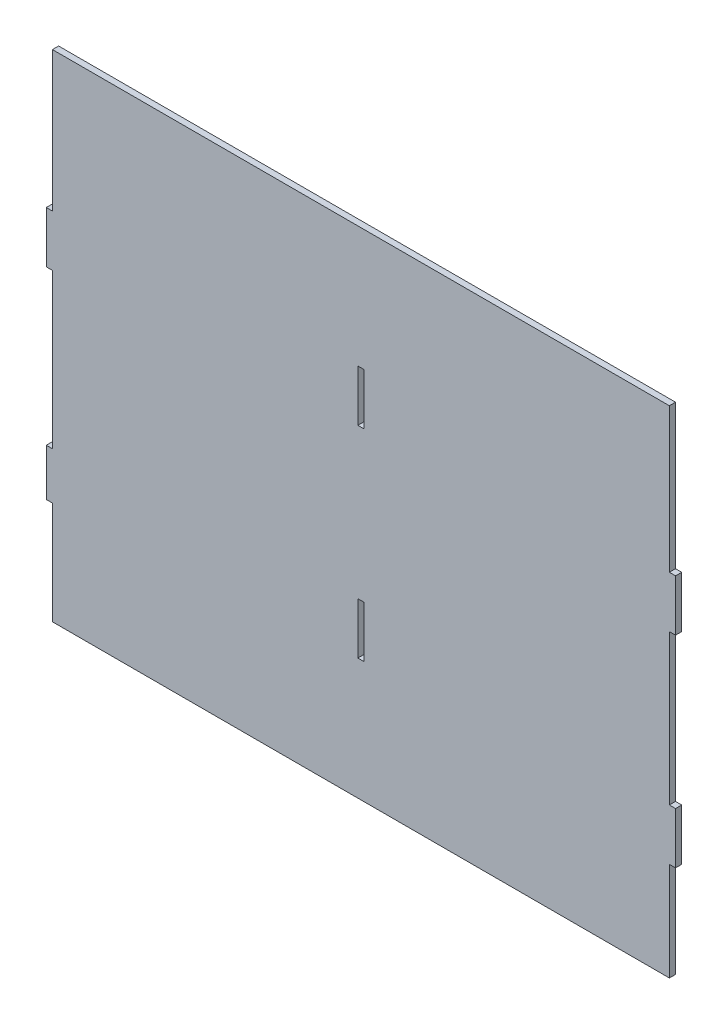
ISO-10303-21;
HEADER;
FILE_DESCRIPTION(('STEP AP214'),'2;1');
FILE_NAME('part.step','',(''),(''),'','','');
FILE_SCHEMA(('AUTOMOTIVE_DESIGN { 1 0 10303 214 1 1 1 1 }'));
ENDSEC;
DATA;
#1=APPLICATION_CONTEXT('core data for automotive mechanical design processes');
#2=APPLICATION_PROTOCOL_DEFINITION('international standard','automotive_design',2000,#1);
#3=PRODUCT_CONTEXT('',#1,'mechanical');
#4=PRODUCT('Part','Part','',(#3));
#5=PRODUCT_RELATED_PRODUCT_CATEGORY('part','',(#4));
#6=PRODUCT_DEFINITION_FORMATION('','',#4);
#7=PRODUCT_DEFINITION_CONTEXT('part definition',#1,'design');
#8=PRODUCT_DEFINITION('design','',#6,#7);
#9=PRODUCT_DEFINITION_SHAPE('','',#8);
#10=(LENGTH_UNIT() NAMED_UNIT(*) SI_UNIT(.MILLI.,.METRE.));
#11=(NAMED_UNIT(*) PLANE_ANGLE_UNIT() SI_UNIT($,.RADIAN.));
#12=(NAMED_UNIT(*) SI_UNIT($,.STERADIAN.) SOLID_ANGLE_UNIT());
#13=UNCERTAINTY_MEASURE_WITH_UNIT(LENGTH_MEASURE(1.E-05),#10,'distance_accuracy_value','');
#14=(GEOMETRIC_REPRESENTATION_CONTEXT(3) GLOBAL_UNCERTAINTY_ASSIGNED_CONTEXT((#13)) GLOBAL_UNIT_ASSIGNED_CONTEXT((#10,
#11,#12)) REPRESENTATION_CONTEXT('',''));
#15=CARTESIAN_POINT('',(0.,0.,0.));
#16=DIRECTION('',(0.,0.,1.));
#17=DIRECTION('',(1.,0.,0.));
#18=AXIS2_PLACEMENT_3D('',#15,#16,#17);
#19=CARTESIAN_POINT('',(0.,0.,6.));
#20=DIRECTION('',(0.,0.,1.));
#21=DIRECTION('',(1.,0.,0.));
#22=AXIS2_PLACEMENT_3D('',#19,#20,#21);
#23=PLANE('',#22);
#24=DIRECTION('',(0.,1.,0.));
#25=VECTOR('',#24,1.);
#26=CARTESIAN_POINT('',(300.,-145.267718015529,6.));
#27=LINE('',#26,#25);
#28=CARTESIAN_POINT('',(300.,-241.,6.));
#29=VERTEX_POINT('',#28);
#30=CARTESIAN_POINT('',(300.,-145.267718015529,6.));
#31=VERTEX_POINT('',#30);
#32=EDGE_CURVE('E285',#29,#31,#27,.T.);
#33=ORIENTED_EDGE('',*,*,#32,.T.);
#34=DIRECTION('',(1.,0.,0.));
#35=VECTOR('',#34,1.);
#36=CARTESIAN_POINT('',(306.,-145.267718015529,6.));
#37=LINE('',#36,#35);
#38=CARTESIAN_POINT('',(306.,-145.267718015529,6.));
#39=VERTEX_POINT('',#38);
#40=EDGE_CURVE('E288',#31,#39,#37,.T.);
#41=ORIENTED_EDGE('',*,*,#40,.T.);
#42=DIRECTION('',(0.,1.,0.));
#43=VECTOR('',#42,1.);
#44=CARTESIAN_POINT('',(306.,-145.267718015529,6.));
#45=LINE('',#44,#43);
#46=CARTESIAN_POINT('',(306.,-95.2677180155292,6.));
#47=VERTEX_POINT('',#46);
#48=EDGE_CURVE('E291',#39,#47,#45,.T.);
#49=ORIENTED_EDGE('',*,*,#48,.T.);
#50=DIRECTION('',(-1.,0.,0.));
#51=VECTOR('',#50,1.);
#52=CARTESIAN_POINT('',(306.,-95.2677180155292,6.));
#53=LINE('',#52,#51);
#54=CARTESIAN_POINT('',(300.,-95.2677180155292,6.));
#55=VERTEX_POINT('',#54);
#56=EDGE_CURVE('E293',#47,#55,#53,.T.);
#57=ORIENTED_EDGE('',*,*,#56,.T.);
#58=DIRECTION('',(0.,1.,0.));
#59=VECTOR('',#58,1.);
#60=CARTESIAN_POINT('',(300.,50.7322819844708,6.));
#61=LINE('',#60,#59);
#62=CARTESIAN_POINT('',(300.,50.7322819844708,6.));
#63=VERTEX_POINT('',#62);
#64=EDGE_CURVE('E295',#55,#63,#61,.T.);
#65=ORIENTED_EDGE('',*,*,#64,.T.);
#66=DIRECTION('',(1.,0.,0.));
#67=VECTOR('',#66,1.);
#68=CARTESIAN_POINT('',(306.,50.7322819844708,6.));
#69=LINE('',#68,#67);
#70=CARTESIAN_POINT('',(306.,50.7322819844708,6.));
#71=VERTEX_POINT('',#70);
#72=EDGE_CURVE('E297',#63,#71,#69,.T.);
#73=ORIENTED_EDGE('',*,*,#72,.T.);
#74=DIRECTION('',(0.,1.,0.));
#75=VECTOR('',#74,1.);
#76=CARTESIAN_POINT('',(306.,100.732281984471,6.));
#77=LINE('',#76,#75);
#78=CARTESIAN_POINT('',(306.,100.732281984471,6.));
#79=VERTEX_POINT('',#78);
#80=EDGE_CURVE('E299',#71,#79,#77,.T.);
#81=ORIENTED_EDGE('',*,*,#80,.T.);
#82=DIRECTION('',(-1.,0.,0.));
#83=VECTOR('',#82,1.);
#84=CARTESIAN_POINT('',(306.,100.732281984471,6.));
#85=LINE('',#84,#83);
#86=CARTESIAN_POINT('',(300.,100.732281984471,6.));
#87=VERTEX_POINT('',#86);
#88=EDGE_CURVE('E301',#79,#87,#85,.T.);
#89=ORIENTED_EDGE('',*,*,#88,.T.);
#90=DIRECTION('',(0.,1.,0.));
#91=VECTOR('',#90,1.);
#92=CARTESIAN_POINT('',(300.,241.,6.));
#93=LINE('',#92,#91);
#94=CARTESIAN_POINT('',(300.,241.,6.));
#95=VERTEX_POINT('',#94);
#96=EDGE_CURVE('E303',#87,#95,#93,.T.);
#97=ORIENTED_EDGE('',*,*,#96,.T.);
#98=DIRECTION('',(-1.,0.,0.));
#99=VECTOR('',#98,1.);
#100=CARTESIAN_POINT('',(-300.,241.,6.));
#101=LINE('',#100,#99);
#102=CARTESIAN_POINT('',(-300.,241.,6.));
#103=VERTEX_POINT('',#102);
#104=EDGE_CURVE('E305',#95,#103,#101,.T.);
#105=ORIENTED_EDGE('',*,*,#104,.T.);
#106=DIRECTION('',(0.,-1.,0.));
#107=VECTOR('',#106,1.);
#108=CARTESIAN_POINT('',(-300.,241.,6.));
#109=LINE('',#108,#107);
#110=CARTESIAN_POINT('',(-300.,105.,6.));
#111=VERTEX_POINT('',#110);
#112=EDGE_CURVE('E307',#103,#111,#109,.T.);
#113=ORIENTED_EDGE('',*,*,#112,.T.);
#114=DIRECTION('',(-1.,0.,0.));
#115=VECTOR('',#114,1.);
#116=CARTESIAN_POINT('',(-306.,105.,6.));
#117=LINE('',#116,#115);
#118=CARTESIAN_POINT('',(-306.,105.,6.));
#119=VERTEX_POINT('',#118);
#120=EDGE_CURVE('E309',#111,#119,#117,.T.);
#121=ORIENTED_EDGE('',*,*,#120,.T.);
#122=DIRECTION('',(0.,-1.,0.));
#123=VECTOR('',#122,1.);
#124=CARTESIAN_POINT('',(-306.,105.,6.));
#125=LINE('',#124,#123);
#126=CARTESIAN_POINT('',(-306.,54.9999999999999,6.));
#127=VERTEX_POINT('',#126);
#128=EDGE_CURVE('E311',#119,#127,#125,.T.);
#129=ORIENTED_EDGE('',*,*,#128,.T.);
#130=DIRECTION('',(1.,0.,0.));
#131=VECTOR('',#130,1.);
#132=CARTESIAN_POINT('',(-306.,54.9999999999999,6.));
#133=LINE('',#132,#131);
#134=CARTESIAN_POINT('',(-300.,54.9999999999999,6.));
#135=VERTEX_POINT('',#134);
#136=EDGE_CURVE('E313',#127,#135,#133,.T.);
#137=ORIENTED_EDGE('',*,*,#136,.T.);
#138=DIRECTION('',(0.,-1.,0.));
#139=VECTOR('',#138,1.);
#140=CARTESIAN_POINT('',(-300.,54.9999999999999,6.));
#141=LINE('',#140,#139);
#142=CARTESIAN_POINT('',(-300.,-95.2677180155292,6.));
#143=VERTEX_POINT('',#142);
#144=EDGE_CURVE('E315',#135,#143,#141,.T.);
#145=ORIENTED_EDGE('',*,*,#144,.T.);
#146=DIRECTION('',(-1.,0.,0.));
#147=VECTOR('',#146,1.);
#148=CARTESIAN_POINT('',(-306.,-95.2677180155292,6.));
#149=LINE('',#148,#147);
#150=CARTESIAN_POINT('',(-306.,-95.2677180155292,6.));
#151=VERTEX_POINT('',#150);
#152=EDGE_CURVE('E317',#143,#151,#149,.T.);
#153=ORIENTED_EDGE('',*,*,#152,.T.);
#154=DIRECTION('',(0.,-1.,0.));
#155=VECTOR('',#154,1.);
#156=CARTESIAN_POINT('',(-306.,-141.,6.));
#157=LINE('',#156,#155);
#158=CARTESIAN_POINT('',(-306.,-141.,6.));
#159=VERTEX_POINT('',#158);
#160=EDGE_CURVE('E319',#151,#159,#157,.T.);
#161=ORIENTED_EDGE('',*,*,#160,.T.);
#162=DIRECTION('',(1.,0.,0.));
#163=VECTOR('',#162,1.);
#164=CARTESIAN_POINT('',(-306.,-141.,6.));
#165=LINE('',#164,#163);
#166=CARTESIAN_POINT('',(-300.,-141.,6.));
#167=VERTEX_POINT('',#166);
#168=EDGE_CURVE('E321',#159,#167,#165,.T.);
#169=ORIENTED_EDGE('',*,*,#168,.T.);
#170=DIRECTION('',(0.,-1.,0.));
#171=VECTOR('',#170,1.);
#172=CARTESIAN_POINT('',(-300.,-141.,6.));
#173=LINE('',#172,#171);
#174=CARTESIAN_POINT('',(-300.,-241.,6.));
#175=VERTEX_POINT('',#174);
#176=EDGE_CURVE('E323',#167,#175,#173,.T.);
#177=ORIENTED_EDGE('',*,*,#176,.T.);
#178=DIRECTION('',(1.,0.,0.));
#179=VECTOR('',#178,1.);
#180=CARTESIAN_POINT('',(-300.,-241.,6.));
#181=LINE('',#180,#179);
#182=EDGE_CURVE('E325',#175,#29,#181,.T.);
#183=ORIENTED_EDGE('',*,*,#182,.T.);
#184=EDGE_LOOP('',(#33,#41,#49,#57,#65,#73,#81,#89,#97,#105,#113,#121,#129,#137,#145,#153,#161,
#169,#177,#183));
#185=FACE_BOUND('',#184,.T.);
#186=DIRECTION('',(-1.,0.,0.));
#187=VECTOR('',#186,1.);
#188=CARTESIAN_POINT('',(-3.00000000000001,123.,6.));
#189=LINE('',#188,#187);
#190=CARTESIAN_POINT('',(2.99999999999999,123.,6.));
#191=VERTEX_POINT('',#190);
#192=CARTESIAN_POINT('',(-3.00000000000001,123.,6.));
#193=VERTEX_POINT('',#192);
#194=EDGE_CURVE('E256',#191,#193,#189,.T.);
#195=ORIENTED_EDGE('',*,*,#194,.F.);
#196=DIRECTION('',(0.,1.,0.));
#197=VECTOR('',#196,1.);
#198=CARTESIAN_POINT('',(2.99999999999999,123.,6.));
#199=LINE('',#198,#197);
#200=CARTESIAN_POINT('',(3.,72.9999999999999,6.));
#201=VERTEX_POINT('',#200);
#202=EDGE_CURVE('E254',#201,#191,#199,.T.);
#203=ORIENTED_EDGE('',*,*,#202,.F.);
#204=DIRECTION('',(1.,0.,0.));
#205=VECTOR('',#204,1.);
#206=CARTESIAN_POINT('',(-3.,72.9999999999999,6.));
#207=LINE('',#206,#205);
#208=CARTESIAN_POINT('',(-3.,72.9999999999999,6.));
#209=VERTEX_POINT('',#208);
#210=EDGE_CURVE('E262',#209,#201,#207,.T.);
#211=ORIENTED_EDGE('',*,*,#210,.F.);
#212=DIRECTION('',(0.,-1.,0.));
#213=VECTOR('',#212,1.);
#214=CARTESIAN_POINT('',(-3.00000000000001,123.,6.));
#215=LINE('',#214,#213);
#216=EDGE_CURVE('E259',#193,#209,#215,.T.);
#217=ORIENTED_EDGE('',*,*,#216,.F.);
#218=EDGE_LOOP('',(#195,#203,#211,#217));
#219=FACE_BOUND('',#218,.T.);
#220=DIRECTION('',(1.,0.,0.));
#221=VECTOR('',#220,1.);
#222=CARTESIAN_POINT('',(-3.00000000000001,-123.,6.));
#223=LINE('',#222,#221);
#224=CARTESIAN_POINT('',(-3.00000000000001,-123.,6.));
#225=VERTEX_POINT('',#224);
#226=CARTESIAN_POINT('',(2.99999999999999,-123.,6.));
#227=VERTEX_POINT('',#226);
#228=EDGE_CURVE('E226',#225,#227,#223,.T.);
#229=ORIENTED_EDGE('',*,*,#228,.F.);
#230=DIRECTION('',(0.,-1.,0.));
#231=VECTOR('',#230,1.);
#232=CARTESIAN_POINT('',(-3.00000000000001,-123.,6.));
#233=LINE('',#232,#231);
#234=CARTESIAN_POINT('',(-3.,-73.0000000000001,6.));
#235=VERTEX_POINT('',#234);
#236=EDGE_CURVE('E218',#235,#225,#233,.T.);
#237=ORIENTED_EDGE('',*,*,#236,.F.);
#238=DIRECTION('',(-1.,0.,0.));
#239=VECTOR('',#238,1.);
#240=CARTESIAN_POINT('',(-3.,-73.0000000000001,6.));
#241=LINE('',#240,#239);
#242=CARTESIAN_POINT('',(3.,-73.0000000000001,6.));
#243=VERTEX_POINT('',#242);
#244=EDGE_CURVE('E240',#243,#235,#241,.T.);
#245=ORIENTED_EDGE('',*,*,#244,.F.);
#246=DIRECTION('',(0.,1.,0.));
#247=VECTOR('',#246,1.);
#248=CARTESIAN_POINT('',(2.99999999999999,-123.,6.));
#249=LINE('',#248,#247);
#250=EDGE_CURVE('E238',#227,#243,#249,.T.);
#251=ORIENTED_EDGE('',*,*,#250,.F.);
#252=EDGE_LOOP('',(#229,#237,#245,#251));
#253=FACE_BOUND('',#252,.T.);
#254=ADVANCED_FACE('F33',(#185,#219,#253),#23,.T.);
#255=CARTESIAN_POINT('',(0.,0.,0.));
#256=DIRECTION('',(0.,0.,1.));
#257=DIRECTION('',(1.,0.,0.));
#258=AXIS2_PLACEMENT_3D('',#255,#256,#257);
#259=PLANE('',#258);
#260=DIRECTION('',(0.,1.,0.));
#261=VECTOR('',#260,1.);
#262=CARTESIAN_POINT('',(2.99999999999999,123.,0.));
#263=LINE('',#262,#261);
#264=CARTESIAN_POINT('',(3.,72.9999999999999,0.));
#265=VERTEX_POINT('',#264);
#266=CARTESIAN_POINT('',(2.99999999999999,123.,0.));
#267=VERTEX_POINT('',#266);
#268=EDGE_CURVE('E234',#265,#267,#263,.T.);
#269=ORIENTED_EDGE('',*,*,#268,.T.);
#270=DIRECTION('',(-1.,0.,0.));
#271=VECTOR('',#270,1.);
#272=CARTESIAN_POINT('',(-3.00000000000001,123.,0.));
#273=LINE('',#272,#271);
#274=CARTESIAN_POINT('',(-3.00000000000001,123.,0.));
#275=VERTEX_POINT('',#274);
#276=EDGE_CURVE('E267',#267,#275,#273,.T.);
#277=ORIENTED_EDGE('',*,*,#276,.T.);
#278=DIRECTION('',(0.,-1.,0.));
#279=VECTOR('',#278,1.);
#280=CARTESIAN_POINT('',(-3.00000000000001,123.,0.));
#281=LINE('',#280,#279);
#282=CARTESIAN_POINT('',(-3.,72.9999999999999,0.));
#283=VERTEX_POINT('',#282);
#284=EDGE_CURVE('E270',#275,#283,#281,.T.);
#285=ORIENTED_EDGE('',*,*,#284,.T.);
#286=DIRECTION('',(1.,0.,0.));
#287=VECTOR('',#286,1.);
#288=CARTESIAN_POINT('',(-3.,72.9999999999999,0.));
#289=LINE('',#288,#287);
#290=EDGE_CURVE('E257',#283,#265,#289,.T.);
#291=ORIENTED_EDGE('',*,*,#290,.T.);
#292=EDGE_LOOP('',(#269,#277,#285,#291));
#293=FACE_BOUND('',#292,.T.);
#294=DIRECTION('',(0.,1.,0.));
#295=VECTOR('',#294,1.);
#296=CARTESIAN_POINT('',(300.,-145.267718015529,0.));
#297=LINE('',#296,#295);
#298=CARTESIAN_POINT('',(300.,-241.,0.));
#299=VERTEX_POINT('',#298);
#300=CARTESIAN_POINT('',(300.,-145.267718015529,0.));
#301=VERTEX_POINT('',#300);
#302=EDGE_CURVE('E284',#299,#301,#297,.T.);
#303=ORIENTED_EDGE('',*,*,#302,.F.);
#304=DIRECTION('',(1.,0.,0.));
#305=VECTOR('',#304,1.);
#306=CARTESIAN_POINT('',(-300.,-241.,0.));
#307=LINE('',#306,#305);
#308=CARTESIAN_POINT('',(-300.,-241.,0.));
#309=VERTEX_POINT('',#308);
#310=EDGE_CURVE('E289',#309,#299,#307,.T.);
#311=ORIENTED_EDGE('',*,*,#310,.F.);
#312=DIRECTION('',(0.,-1.,0.));
#313=VECTOR('',#312,1.);
#314=CARTESIAN_POINT('',(-300.,-141.,0.));
#315=LINE('',#314,#313);
#316=CARTESIAN_POINT('',(-300.,-141.,0.));
#317=VERTEX_POINT('',#316);
#318=EDGE_CURVE('E364',#317,#309,#315,.T.);
#319=ORIENTED_EDGE('',*,*,#318,.F.);
#320=DIRECTION('',(1.,0.,0.));
#321=VECTOR('',#320,1.);
#322=CARTESIAN_POINT('',(-306.,-141.,0.));
#323=LINE('',#322,#321);
#324=CARTESIAN_POINT('',(-306.,-141.,0.));
#325=VERTEX_POINT('',#324);
#326=EDGE_CURVE('E362',#325,#317,#323,.T.);
#327=ORIENTED_EDGE('',*,*,#326,.F.);
#328=DIRECTION('',(0.,-1.,0.));
#329=VECTOR('',#328,1.);
#330=CARTESIAN_POINT('',(-306.,-141.,0.));
#331=LINE('',#330,#329);
#332=CARTESIAN_POINT('',(-306.,-95.2677180155292,0.));
#333=VERTEX_POINT('',#332);
#334=EDGE_CURVE('E360',#333,#325,#331,.T.);
#335=ORIENTED_EDGE('',*,*,#334,.F.);
#336=DIRECTION('',(-1.,0.,0.));
#337=VECTOR('',#336,1.);
#338=CARTESIAN_POINT('',(-306.,-95.2677180155292,0.));
#339=LINE('',#338,#337);
#340=CARTESIAN_POINT('',(-300.,-95.2677180155292,0.));
#341=VERTEX_POINT('',#340);
#342=EDGE_CURVE('E358',#341,#333,#339,.T.);
#343=ORIENTED_EDGE('',*,*,#342,.F.);
#344=DIRECTION('',(0.,-1.,0.));
#345=VECTOR('',#344,1.);
#346=CARTESIAN_POINT('',(-300.,54.9999999999999,0.));
#347=LINE('',#346,#345);
#348=CARTESIAN_POINT('',(-300.,54.9999999999999,0.));
#349=VERTEX_POINT('',#348);
#350=EDGE_CURVE('E356',#349,#341,#347,.T.);
#351=ORIENTED_EDGE('',*,*,#350,.F.);
#352=DIRECTION('',(1.,0.,0.));
#353=VECTOR('',#352,1.);
#354=CARTESIAN_POINT('',(-306.,54.9999999999999,0.));
#355=LINE('',#354,#353);
#356=CARTESIAN_POINT('',(-306.,54.9999999999999,0.));
#357=VERTEX_POINT('',#356);
#358=EDGE_CURVE('E354',#357,#349,#355,.T.);
#359=ORIENTED_EDGE('',*,*,#358,.F.);
#360=DIRECTION('',(0.,-1.,0.));
#361=VECTOR('',#360,1.);
#362=CARTESIAN_POINT('',(-306.,105.,0.));
#363=LINE('',#362,#361);
#364=CARTESIAN_POINT('',(-306.,105.,0.));
#365=VERTEX_POINT('',#364);
#366=EDGE_CURVE('E352',#365,#357,#363,.T.);
#367=ORIENTED_EDGE('',*,*,#366,.F.);
#368=DIRECTION('',(-1.,0.,0.));
#369=VECTOR('',#368,1.);
#370=CARTESIAN_POINT('',(-306.,105.,0.));
#371=LINE('',#370,#369);
#372=CARTESIAN_POINT('',(-300.,105.,0.));
#373=VERTEX_POINT('',#372);
#374=EDGE_CURVE('E350',#373,#365,#371,.T.);
#375=ORIENTED_EDGE('',*,*,#374,.F.);
#376=DIRECTION('',(0.,-1.,0.));
#377=VECTOR('',#376,1.);
#378=CARTESIAN_POINT('',(-300.,241.,0.));
#379=LINE('',#378,#377);
#380=CARTESIAN_POINT('',(-300.,241.,0.));
#381=VERTEX_POINT('',#380);
#382=EDGE_CURVE('E348',#381,#373,#379,.T.);
#383=ORIENTED_EDGE('',*,*,#382,.F.);
#384=DIRECTION('',(-1.,0.,0.));
#385=VECTOR('',#384,1.);
#386=CARTESIAN_POINT('',(-300.,241.,0.));
#387=LINE('',#386,#385);
#388=CARTESIAN_POINT('',(300.,241.,0.));
#389=VERTEX_POINT('',#388);
#390=EDGE_CURVE('E346',#389,#381,#387,.T.);
#391=ORIENTED_EDGE('',*,*,#390,.F.);
#392=DIRECTION('',(0.,1.,0.));
#393=VECTOR('',#392,1.);
#394=CARTESIAN_POINT('',(300.,241.,0.));
#395=LINE('',#394,#393);
#396=CARTESIAN_POINT('',(300.,100.732281984471,0.));
#397=VERTEX_POINT('',#396);
#398=EDGE_CURVE('E344',#397,#389,#395,.T.);
#399=ORIENTED_EDGE('',*,*,#398,.F.);
#400=DIRECTION('',(-1.,0.,0.));
#401=VECTOR('',#400,1.);
#402=CARTESIAN_POINT('',(306.,100.732281984471,0.));
#403=LINE('',#402,#401);
#404=CARTESIAN_POINT('',(306.,100.732281984471,0.));
#405=VERTEX_POINT('',#404);
#406=EDGE_CURVE('E342',#405,#397,#403,.T.);
#407=ORIENTED_EDGE('',*,*,#406,.F.);
#408=DIRECTION('',(0.,1.,0.));
#409=VECTOR('',#408,1.);
#410=CARTESIAN_POINT('',(306.,100.732281984471,0.));
#411=LINE('',#410,#409);
#412=CARTESIAN_POINT('',(306.,50.7322819844708,0.));
#413=VERTEX_POINT('',#412);
#414=EDGE_CURVE('E340',#413,#405,#411,.T.);
#415=ORIENTED_EDGE('',*,*,#414,.F.);
#416=DIRECTION('',(1.,0.,0.));
#417=VECTOR('',#416,1.);
#418=CARTESIAN_POINT('',(306.,50.7322819844708,0.));
#419=LINE('',#418,#417);
#420=CARTESIAN_POINT('',(300.,50.7322819844708,0.));
#421=VERTEX_POINT('',#420);
#422=EDGE_CURVE('E338',#421,#413,#419,.T.);
#423=ORIENTED_EDGE('',*,*,#422,.F.);
#424=DIRECTION('',(0.,1.,0.));
#425=VECTOR('',#424,1.);
#426=CARTESIAN_POINT('',(300.,50.7322819844708,0.));
#427=LINE('',#426,#425);
#428=CARTESIAN_POINT('',(300.,-95.2677180155292,0.));
#429=VERTEX_POINT('',#428);
#430=EDGE_CURVE('E336',#429,#421,#427,.T.);
#431=ORIENTED_EDGE('',*,*,#430,.F.);
#432=DIRECTION('',(-1.,0.,0.));
#433=VECTOR('',#432,1.);
#434=CARTESIAN_POINT('',(306.,-95.2677180155292,0.));
#435=LINE('',#434,#433);
#436=CARTESIAN_POINT('',(306.,-95.2677180155292,0.));
#437=VERTEX_POINT('',#436);
#438=EDGE_CURVE('E334',#437,#429,#435,.T.);
#439=ORIENTED_EDGE('',*,*,#438,.F.);
#440=DIRECTION('',(0.,1.,0.));
#441=VECTOR('',#440,1.);
#442=CARTESIAN_POINT('',(306.,-145.267718015529,0.));
#443=LINE('',#442,#441);
#444=CARTESIAN_POINT('',(306.,-145.267718015529,0.));
#445=VERTEX_POINT('',#444);
#446=EDGE_CURVE('E332',#445,#437,#443,.T.);
#447=ORIENTED_EDGE('',*,*,#446,.F.);
#448=DIRECTION('',(1.,0.,0.));
#449=VECTOR('',#448,1.);
#450=CARTESIAN_POINT('',(306.,-145.267718015529,0.));
#451=LINE('',#450,#449);
#452=EDGE_CURVE('E330',#301,#445,#451,.T.);
#453=ORIENTED_EDGE('',*,*,#452,.F.);
#454=EDGE_LOOP('',(#303,#311,#319,#327,#335,#343,#351,#359,#367,#375,#383,#391,#399,#407,#415,
#423,#431,#439,#447,#453));
#455=FACE_BOUND('',#454,.T.);
#456=DIRECTION('',(0.,-1.,0.));
#457=VECTOR('',#456,1.);
#458=CARTESIAN_POINT('',(-3.00000000000001,-123.,0.));
#459=LINE('',#458,#457);
#460=CARTESIAN_POINT('',(-3.,-73.0000000000001,0.));
#461=VERTEX_POINT('',#460);
#462=CARTESIAN_POINT('',(-3.00000000000001,-123.,0.));
#463=VERTEX_POINT('',#462);
#464=EDGE_CURVE('E56',#461,#463,#459,.T.);
#465=ORIENTED_EDGE('',*,*,#464,.T.);
#466=DIRECTION('',(1.,0.,0.));
#467=VECTOR('',#466,1.);
#468=CARTESIAN_POINT('',(-3.00000000000001,-123.,0.));
#469=LINE('',#468,#467);
#470=CARTESIAN_POINT('',(2.99999999999999,-123.,0.));
#471=VERTEX_POINT('',#470);
#472=EDGE_CURVE('E233',#463,#471,#469,.T.);
#473=ORIENTED_EDGE('',*,*,#472,.T.);
#474=DIRECTION('',(0.,1.,0.));
#475=VECTOR('',#474,1.);
#476=CARTESIAN_POINT('',(2.99999999999999,-123.,0.));
#477=LINE('',#476,#475);
#478=CARTESIAN_POINT('',(3.,-73.0000000000001,0.));
#479=VERTEX_POINT('',#478);
#480=EDGE_CURVE('E246',#471,#479,#477,.T.);
#481=ORIENTED_EDGE('',*,*,#480,.T.);
#482=DIRECTION('',(-1.,0.,0.));
#483=VECTOR('',#482,1.);
#484=CARTESIAN_POINT('',(-3.,-73.0000000000001,0.));
#485=LINE('',#484,#483);
#486=EDGE_CURVE('E227',#479,#461,#485,.T.);
#487=ORIENTED_EDGE('',*,*,#486,.T.);
#488=EDGE_LOOP('',(#465,#473,#481,#487));
#489=FACE_BOUND('',#488,.T.);
#490=ADVANCED_FACE('F430',(#293,#455,#489),#259,.F.);
#491=CARTESIAN_POINT('',(300.,-145.267718015529,6.));
#492=DIRECTION('',(-1.,0.,0.));
#493=DIRECTION('',(0.,-1.,0.));
#494=AXIS2_PLACEMENT_3D('',#491,#492,#493);
#495=PLANE('',#494);
#496=ORIENTED_EDGE('',*,*,#302,.T.);
#497=DIRECTION('',(0.,0.,-1.));
#498=VECTOR('',#497,1.);
#499=CARTESIAN_POINT('',(300.,-145.267718015529,6.));
#500=LINE('',#499,#498);
#501=EDGE_CURVE('E11',#31,#301,#500,.T.);
#502=ORIENTED_EDGE('',*,*,#501,.F.);
#503=ORIENTED_EDGE('',*,*,#32,.F.);
#504=DIRECTION('',(0.,0.,-1.));
#505=VECTOR('',#504,1.);
#506=CARTESIAN_POINT('',(300.,-241.,6.));
#507=LINE('',#506,#505);
#508=EDGE_CURVE('E327',#29,#299,#507,.T.);
#509=ORIENTED_EDGE('',*,*,#508,.T.);
#510=EDGE_LOOP('',(#496,#502,#503,#509));
#511=FACE_BOUND('',#510,.T.);
#512=ADVANCED_FACE('F35',(#511),#495,.F.);
#513=CARTESIAN_POINT('',(306.,-145.267718015529,6.));
#514=DIRECTION('',(0.,1.,0.));
#515=DIRECTION('',(0.,0.,1.));
#516=AXIS2_PLACEMENT_3D('',#513,#514,#515);
#517=PLANE('',#516);
#518=ORIENTED_EDGE('',*,*,#452,.T.);
#519=DIRECTION('',(0.,0.,-1.));
#520=VECTOR('',#519,1.);
#521=CARTESIAN_POINT('',(306.,-145.267718015529,6.));
#522=LINE('',#521,#520);
#523=EDGE_CURVE('E41',#39,#445,#522,.T.);
#524=ORIENTED_EDGE('',*,*,#523,.F.);
#525=ORIENTED_EDGE('',*,*,#40,.F.);
#526=ORIENTED_EDGE('',*,*,#501,.T.);
#527=EDGE_LOOP('',(#518,#524,#525,#526));
#528=FACE_BOUND('',#527,.T.);
#529=ADVANCED_FACE('F448',(#528),#517,.F.);
#530=CARTESIAN_POINT('',(306.,-145.267718015529,6.));
#531=DIRECTION('',(-1.,0.,0.));
#532=DIRECTION('',(0.,0.,1.));
#533=AXIS2_PLACEMENT_3D('',#530,#531,#532);
#534=PLANE('',#533);
#535=ORIENTED_EDGE('',*,*,#446,.T.);
#536=DIRECTION('',(0.,0.,-1.));
#537=VECTOR('',#536,1.);
#538=CARTESIAN_POINT('',(306.,-95.2677180155292,6.));
#539=LINE('',#538,#537);
#540=EDGE_CURVE('E417',#47,#437,#539,.T.);
#541=ORIENTED_EDGE('',*,*,#540,.F.);
#542=ORIENTED_EDGE('',*,*,#48,.F.);
#543=ORIENTED_EDGE('',*,*,#523,.T.);
#544=EDGE_LOOP('',(#535,#541,#542,#543));
#545=FACE_BOUND('',#544,.T.);
#546=ADVANCED_FACE('F424',(#545),#534,.F.);
#547=CARTESIAN_POINT('',(306.,-95.2677180155292,6.));
#548=DIRECTION('',(0.,-1.,0.));
#549=DIRECTION('',(0.,0.,-1.));
#550=AXIS2_PLACEMENT_3D('',#547,#548,#549);
#551=PLANE('',#550);
#552=ORIENTED_EDGE('',*,*,#438,.T.);
#553=DIRECTION('',(0.,0.,-1.));
#554=VECTOR('',#553,1.);
#555=CARTESIAN_POINT('',(300.,-95.2677180155292,6.));
#556=LINE('',#555,#554);
#557=EDGE_CURVE('E414',#55,#429,#556,.T.);
#558=ORIENTED_EDGE('',*,*,#557,.F.);
#559=ORIENTED_EDGE('',*,*,#56,.F.);
#560=ORIENTED_EDGE('',*,*,#540,.T.);
#561=EDGE_LOOP('',(#552,#558,#559,#560));
#562=FACE_BOUND('',#561,.T.);
#563=ADVANCED_FACE('F436',(#562),#551,.F.);
#564=CARTESIAN_POINT('',(300.,50.7322819844708,6.));
#565=DIRECTION('',(-1.,0.,0.));
#566=DIRECTION('',(0.,0.,1.));
#567=AXIS2_PLACEMENT_3D('',#564,#565,#566);
#568=PLANE('',#567);
#569=ORIENTED_EDGE('',*,*,#430,.T.);
#570=DIRECTION('',(0.,0.,-1.));
#571=VECTOR('',#570,1.);
#572=CARTESIAN_POINT('',(300.,50.7322819844708,6.));
#573=LINE('',#572,#571);
#574=EDGE_CURVE('E411',#63,#421,#573,.T.);
#575=ORIENTED_EDGE('',*,*,#574,.F.);
#576=ORIENTED_EDGE('',*,*,#64,.F.);
#577=ORIENTED_EDGE('',*,*,#557,.T.);
#578=EDGE_LOOP('',(#569,#575,#576,#577));
#579=FACE_BOUND('',#578,.T.);
#580=ADVANCED_FACE('F440',(#579),#568,.F.);
#581=CARTESIAN_POINT('',(306.,50.7322819844708,6.));
#582=DIRECTION('',(0.,1.,0.));
#583=DIRECTION('',(0.,0.,1.));
#584=AXIS2_PLACEMENT_3D('',#581,#582,#583);
#585=PLANE('',#584);
#586=ORIENTED_EDGE('',*,*,#422,.T.);
#587=DIRECTION('',(0.,0.,-1.));
#588=VECTOR('',#587,1.);
#589=CARTESIAN_POINT('',(306.,50.7322819844708,6.));
#590=LINE('',#589,#588);
#591=EDGE_CURVE('E408',#71,#413,#590,.T.);
#592=ORIENTED_EDGE('',*,*,#591,.F.);
#593=ORIENTED_EDGE('',*,*,#72,.F.);
#594=ORIENTED_EDGE('',*,*,#574,.T.);
#595=EDGE_LOOP('',(#586,#592,#593,#594));
#596=FACE_BOUND('',#595,.T.);
#597=ADVANCED_FACE('F521',(#596),#585,.F.);
#598=CARTESIAN_POINT('',(306.,100.732281984471,6.));
#599=DIRECTION('',(-1.,0.,0.));
#600=DIRECTION('',(0.,0.,1.));
#601=AXIS2_PLACEMENT_3D('',#598,#599,#600);
#602=PLANE('',#601);
#603=ORIENTED_EDGE('',*,*,#414,.T.);
#604=DIRECTION('',(0.,0.,-1.));
#605=VECTOR('',#604,1.);
#606=CARTESIAN_POINT('',(306.,100.732281984471,6.));
#607=LINE('',#606,#605);
#608=EDGE_CURVE('E405',#79,#405,#607,.T.);
#609=ORIENTED_EDGE('',*,*,#608,.F.);
#610=ORIENTED_EDGE('',*,*,#80,.F.);
#611=ORIENTED_EDGE('',*,*,#591,.T.);
#612=EDGE_LOOP('',(#603,#609,#610,#611));
#613=FACE_BOUND('',#612,.T.);
#614=ADVANCED_FACE('F519',(#613),#602,.F.);
#615=CARTESIAN_POINT('',(306.,100.732281984471,6.));
#616=DIRECTION('',(0.,-1.,0.));
#617=DIRECTION('',(0.,0.,-1.));
#618=AXIS2_PLACEMENT_3D('',#615,#616,#617);
#619=PLANE('',#618);
#620=ORIENTED_EDGE('',*,*,#406,.T.);
#621=DIRECTION('',(0.,0.,-1.));
#622=VECTOR('',#621,1.);
#623=CARTESIAN_POINT('',(300.,100.732281984471,6.));
#624=LINE('',#623,#622);
#625=EDGE_CURVE('E402',#87,#397,#624,.T.);
#626=ORIENTED_EDGE('',*,*,#625,.F.);
#627=ORIENTED_EDGE('',*,*,#88,.F.);
#628=ORIENTED_EDGE('',*,*,#608,.T.);
#629=EDGE_LOOP('',(#620,#626,#627,#628));
#630=FACE_BOUND('',#629,.T.);
#631=ADVANCED_FACE('F514',(#630),#619,.F.);
#632=CARTESIAN_POINT('',(300.,241.,6.));
#633=DIRECTION('',(-1.,0.,0.));
#634=DIRECTION('',(0.,-1.,0.));
#635=AXIS2_PLACEMENT_3D('',#632,#633,#634);
#636=PLANE('',#635);
#637=ORIENTED_EDGE('',*,*,#398,.T.);
#638=DIRECTION('',(0.,0.,-1.));
#639=VECTOR('',#638,1.);
#640=CARTESIAN_POINT('',(300.,241.,6.));
#641=LINE('',#640,#639);
#642=EDGE_CURVE('E399',#95,#389,#641,.T.);
#643=ORIENTED_EDGE('',*,*,#642,.F.);
#644=ORIENTED_EDGE('',*,*,#96,.F.);
#645=ORIENTED_EDGE('',*,*,#625,.T.);
#646=EDGE_LOOP('',(#637,#643,#644,#645));
#647=FACE_BOUND('',#646,.T.);
#648=ADVANCED_FACE('F509',(#647),#636,.F.);
#649=CARTESIAN_POINT('',(-300.,241.,6.));
#650=DIRECTION('',(0.,-1.,0.));
#651=DIRECTION('',(1.,0.,0.));
#652=AXIS2_PLACEMENT_3D('',#649,#650,#651);
#653=PLANE('',#652);
#654=ORIENTED_EDGE('',*,*,#390,.T.);
#655=DIRECTION('',(0.,0.,-1.));
#656=VECTOR('',#655,1.);
#657=CARTESIAN_POINT('',(-300.,241.,6.));
#658=LINE('',#657,#656);
#659=EDGE_CURVE('E396',#103,#381,#658,.T.);
#660=ORIENTED_EDGE('',*,*,#659,.F.);
#661=ORIENTED_EDGE('',*,*,#104,.F.);
#662=ORIENTED_EDGE('',*,*,#642,.T.);
#663=EDGE_LOOP('',(#654,#660,#661,#662));
#664=FACE_BOUND('',#663,.T.);
#665=ADVANCED_FACE('F505',(#664),#653,.F.);
#666=CARTESIAN_POINT('',(-300.,241.,6.));
#667=DIRECTION('',(1.,0.,0.));
#668=DIRECTION('',(0.,0.,-1.));
#669=AXIS2_PLACEMENT_3D('',#666,#667,#668);
#670=PLANE('',#669);
#671=ORIENTED_EDGE('',*,*,#382,.T.);
#672=DIRECTION('',(0.,0.,-1.));
#673=VECTOR('',#672,1.);
#674=CARTESIAN_POINT('',(-300.,105.,6.));
#675=LINE('',#674,#673);
#676=EDGE_CURVE('E393',#111,#373,#675,.T.);
#677=ORIENTED_EDGE('',*,*,#676,.F.);
#678=ORIENTED_EDGE('',*,*,#112,.F.);
#679=ORIENTED_EDGE('',*,*,#659,.T.);
#680=EDGE_LOOP('',(#671,#677,#678,#679));
#681=FACE_BOUND('',#680,.T.);
#682=ADVANCED_FACE('F500',(#681),#670,.F.);
#683=CARTESIAN_POINT('',(-306.,105.,6.));
#684=DIRECTION('',(0.,-1.,0.));
#685=DIRECTION('',(0.,0.,-1.));
#686=AXIS2_PLACEMENT_3D('',#683,#684,#685);
#687=PLANE('',#686);
#688=ORIENTED_EDGE('',*,*,#374,.T.);
#689=DIRECTION('',(0.,0.,-1.));
#690=VECTOR('',#689,1.);
#691=CARTESIAN_POINT('',(-306.,105.,6.));
#692=LINE('',#691,#690);
#693=EDGE_CURVE('E390',#119,#365,#692,.T.);
#694=ORIENTED_EDGE('',*,*,#693,.F.);
#695=ORIENTED_EDGE('',*,*,#120,.F.);
#696=ORIENTED_EDGE('',*,*,#676,.T.);
#697=EDGE_LOOP('',(#688,#694,#695,#696));
#698=FACE_BOUND('',#697,.T.);
#699=ADVANCED_FACE('F494',(#698),#687,.F.);
#700=CARTESIAN_POINT('',(-306.,105.,6.));
#701=DIRECTION('',(1.,0.,0.));
#702=DIRECTION('',(0.,0.,-1.));
#703=AXIS2_PLACEMENT_3D('',#700,#701,#702);
#704=PLANE('',#703);
#705=ORIENTED_EDGE('',*,*,#366,.T.);
#706=DIRECTION('',(0.,0.,-1.));
#707=VECTOR('',#706,1.);
#708=CARTESIAN_POINT('',(-306.,54.9999999999999,6.));
#709=LINE('',#708,#707);
#710=EDGE_CURVE('E387',#127,#357,#709,.T.);
#711=ORIENTED_EDGE('',*,*,#710,.F.);
#712=ORIENTED_EDGE('',*,*,#128,.F.);
#713=ORIENTED_EDGE('',*,*,#693,.T.);
#714=EDGE_LOOP('',(#705,#711,#712,#713));
#715=FACE_BOUND('',#714,.T.);
#716=ADVANCED_FACE('F490',(#715),#704,.F.);
#717=CARTESIAN_POINT('',(-306.,54.9999999999999,6.));
#718=DIRECTION('',(0.,1.,0.));
#719=DIRECTION('',(0.,0.,1.));
#720=AXIS2_PLACEMENT_3D('',#717,#718,#719);
#721=PLANE('',#720);
#722=ORIENTED_EDGE('',*,*,#358,.T.);
#723=DIRECTION('',(0.,0.,-1.));
#724=VECTOR('',#723,1.);
#725=CARTESIAN_POINT('',(-300.,54.9999999999999,6.));
#726=LINE('',#725,#724);
#727=EDGE_CURVE('E384',#135,#349,#726,.T.);
#728=ORIENTED_EDGE('',*,*,#727,.F.);
#729=ORIENTED_EDGE('',*,*,#136,.F.);
#730=ORIENTED_EDGE('',*,*,#710,.T.);
#731=EDGE_LOOP('',(#722,#728,#729,#730));
#732=FACE_BOUND('',#731,.T.);
#733=ADVANCED_FACE('F485',(#732),#721,.F.);
#734=CARTESIAN_POINT('',(-300.,54.9999999999999,6.));
#735=DIRECTION('',(1.,0.,0.));
#736=DIRECTION('',(0.,1.,0.));
#737=AXIS2_PLACEMENT_3D('',#734,#735,#736);
#738=PLANE('',#737);
#739=ORIENTED_EDGE('',*,*,#350,.T.);
#740=DIRECTION('',(0.,0.,-1.));
#741=VECTOR('',#740,1.);
#742=CARTESIAN_POINT('',(-300.,-95.2677180155292,6.));
#743=LINE('',#742,#741);
#744=EDGE_CURVE('E381',#143,#341,#743,.T.);
#745=ORIENTED_EDGE('',*,*,#744,.F.);
#746=ORIENTED_EDGE('',*,*,#144,.F.);
#747=ORIENTED_EDGE('',*,*,#727,.T.);
#748=EDGE_LOOP('',(#739,#745,#746,#747));
#749=FACE_BOUND('',#748,.T.);
#750=ADVANCED_FACE('F479',(#749),#738,.F.);
#751=CARTESIAN_POINT('',(-306.,-95.2677180155292,6.));
#752=DIRECTION('',(0.,-1.,0.));
#753=DIRECTION('',(0.,0.,-1.));
#754=AXIS2_PLACEMENT_3D('',#751,#752,#753);
#755=PLANE('',#754);
#756=ORIENTED_EDGE('',*,*,#342,.T.);
#757=DIRECTION('',(0.,0.,-1.));
#758=VECTOR('',#757,1.);
#759=CARTESIAN_POINT('',(-306.,-95.2677180155292,6.));
#760=LINE('',#759,#758);
#761=EDGE_CURVE('E378',#151,#333,#760,.T.);
#762=ORIENTED_EDGE('',*,*,#761,.F.);
#763=ORIENTED_EDGE('',*,*,#152,.F.);
#764=ORIENTED_EDGE('',*,*,#744,.T.);
#765=EDGE_LOOP('',(#756,#762,#763,#764));
#766=FACE_BOUND('',#765,.T.);
#767=ADVANCED_FACE('F475',(#766),#755,.F.);
#768=CARTESIAN_POINT('',(-306.,-141.,6.));
#769=DIRECTION('',(1.,0.,0.));
#770=DIRECTION('',(0.,0.,-1.));
#771=AXIS2_PLACEMENT_3D('',#768,#769,#770);
#772=PLANE('',#771);
#773=ORIENTED_EDGE('',*,*,#334,.T.);
#774=DIRECTION('',(0.,0.,-1.));
#775=VECTOR('',#774,1.);
#776=CARTESIAN_POINT('',(-306.,-141.,6.));
#777=LINE('',#776,#775);
#778=EDGE_CURVE('E375',#159,#325,#777,.T.);
#779=ORIENTED_EDGE('',*,*,#778,.F.);
#780=ORIENTED_EDGE('',*,*,#160,.F.);
#781=ORIENTED_EDGE('',*,*,#761,.T.);
#782=EDGE_LOOP('',(#773,#779,#780,#781));
#783=FACE_BOUND('',#782,.T.);
#784=ADVANCED_FACE('F470',(#783),#772,.F.);
#785=CARTESIAN_POINT('',(-306.,-141.,6.));
#786=DIRECTION('',(0.,1.,0.));
#787=DIRECTION('',(-1.,0.,0.));
#788=AXIS2_PLACEMENT_3D('',#785,#786,#787);
#789=PLANE('',#788);
#790=ORIENTED_EDGE('',*,*,#326,.T.);
#791=DIRECTION('',(0.,0.,-1.));
#792=VECTOR('',#791,1.);
#793=CARTESIAN_POINT('',(-300.,-141.,6.));
#794=LINE('',#793,#792);
#795=EDGE_CURVE('E372',#167,#317,#794,.T.);
#796=ORIENTED_EDGE('',*,*,#795,.F.);
#797=ORIENTED_EDGE('',*,*,#168,.F.);
#798=ORIENTED_EDGE('',*,*,#778,.T.);
#799=EDGE_LOOP('',(#790,#796,#797,#798));
#800=FACE_BOUND('',#799,.T.);
#801=ADVANCED_FACE('F464',(#800),#789,.F.);
#802=CARTESIAN_POINT('',(-300.,-141.,6.));
#803=DIRECTION('',(1.,0.,0.));
#804=DIRECTION('',(0.,1.,0.));
#805=AXIS2_PLACEMENT_3D('',#802,#803,#804);
#806=PLANE('',#805);
#807=ORIENTED_EDGE('',*,*,#318,.T.);
#808=DIRECTION('',(0.,0.,-1.));
#809=VECTOR('',#808,1.);
#810=CARTESIAN_POINT('',(-300.,-241.,6.));
#811=LINE('',#810,#809);
#812=EDGE_CURVE('E369',#175,#309,#811,.T.);
#813=ORIENTED_EDGE('',*,*,#812,.F.);
#814=ORIENTED_EDGE('',*,*,#176,.F.);
#815=ORIENTED_EDGE('',*,*,#795,.T.);
#816=EDGE_LOOP('',(#807,#813,#814,#815));
#817=FACE_BOUND('',#816,.T.);
#818=ADVANCED_FACE('F460',(#817),#806,.F.);
#819=CARTESIAN_POINT('',(-300.,-241.,6.));
#820=DIRECTION('',(0.,1.,0.));
#821=DIRECTION('',(-1.,0.,0.));
#822=AXIS2_PLACEMENT_3D('',#819,#820,#821);
#823=PLANE('',#822);
#824=ORIENTED_EDGE('',*,*,#310,.T.);
#825=ORIENTED_EDGE('',*,*,#508,.F.);
#826=ORIENTED_EDGE('',*,*,#182,.F.);
#827=ORIENTED_EDGE('',*,*,#812,.T.);
#828=EDGE_LOOP('',(#824,#825,#826,#827));
#829=FACE_BOUND('',#828,.T.);
#830=ADVANCED_FACE('F455',(#829),#823,.F.);
#831=CARTESIAN_POINT('',(2.99999999999999,123.,6.));
#832=DIRECTION('',(-1.,0.,0.));
#833=DIRECTION('',(0.,-1.,0.));
#834=AXIS2_PLACEMENT_3D('',#831,#832,#833);
#835=PLANE('',#834);
#836=ORIENTED_EDGE('',*,*,#268,.F.);
#837=DIRECTION('',(0.,0.,-1.));
#838=VECTOR('',#837,1.);
#839=CARTESIAN_POINT('',(3.,72.9999999999999,6.));
#840=LINE('',#839,#838);
#841=EDGE_CURVE('E264',#201,#265,#840,.T.);
#842=ORIENTED_EDGE('',*,*,#841,.F.);
#843=ORIENTED_EDGE('',*,*,#202,.T.);
#844=DIRECTION('',(0.,0.,-1.));
#845=VECTOR('',#844,1.);
#846=CARTESIAN_POINT('',(2.99999999999999,123.,6.));
#847=LINE('',#846,#845);
#848=EDGE_CURVE('E281',#191,#267,#847,.T.);
#849=ORIENTED_EDGE('',*,*,#848,.T.);
#850=EDGE_LOOP('',(#836,#842,#843,#849));
#851=FACE_BOUND('',#850,.T.);
#852=ADVANCED_FACE('F538',(#851),#835,.T.);
#853=CARTESIAN_POINT('',(-3.00000000000001,123.,6.));
#854=DIRECTION('',(0.,-1.,0.));
#855=DIRECTION('',(0.,0.,-1.));
#856=AXIS2_PLACEMENT_3D('',#853,#854,#855);
#857=PLANE('',#856);
#858=ORIENTED_EDGE('',*,*,#276,.F.);
#859=ORIENTED_EDGE('',*,*,#848,.F.);
#860=ORIENTED_EDGE('',*,*,#194,.T.);
#861=DIRECTION('',(0.,0.,-1.));
#862=VECTOR('',#861,1.);
#863=CARTESIAN_POINT('',(-3.00000000000001,123.,6.));
#864=LINE('',#863,#862);
#865=EDGE_CURVE('E279',#193,#275,#864,.T.);
#866=ORIENTED_EDGE('',*,*,#865,.T.);
#867=EDGE_LOOP('',(#858,#859,#860,#866));
#868=FACE_BOUND('',#867,.T.);
#869=ADVANCED_FACE('F624',(#868),#857,.T.);
#870=CARTESIAN_POINT('',(-3.00000000000001,123.,6.));
#871=DIRECTION('',(1.,0.,0.));
#872=DIRECTION('',(0.,1.,0.));
#873=AXIS2_PLACEMENT_3D('',#870,#871,#872);
#874=PLANE('',#873);
#875=ORIENTED_EDGE('',*,*,#284,.F.);
#876=ORIENTED_EDGE('',*,*,#865,.F.);
#877=ORIENTED_EDGE('',*,*,#216,.T.);
#878=DIRECTION('',(0.,0.,-1.));
#879=VECTOR('',#878,1.);
#880=CARTESIAN_POINT('',(-3.,72.9999999999999,6.));
#881=LINE('',#880,#879);
#882=EDGE_CURVE('E277',#209,#283,#881,.T.);
#883=ORIENTED_EDGE('',*,*,#882,.T.);
#884=EDGE_LOOP('',(#875,#876,#877,#883));
#885=FACE_BOUND('',#884,.T.);
#886=ADVANCED_FACE('F631',(#885),#874,.T.);
#887=CARTESIAN_POINT('',(-3.,72.9999999999999,6.));
#888=DIRECTION('',(0.,1.,0.));
#889=DIRECTION('',(0.,0.,1.));
#890=AXIS2_PLACEMENT_3D('',#887,#888,#889);
#891=PLANE('',#890);
#892=ORIENTED_EDGE('',*,*,#290,.F.);
#893=ORIENTED_EDGE('',*,*,#882,.F.);
#894=ORIENTED_EDGE('',*,*,#210,.T.);
#895=ORIENTED_EDGE('',*,*,#841,.T.);
#896=EDGE_LOOP('',(#892,#893,#894,#895));
#897=FACE_BOUND('',#896,.T.);
#898=ADVANCED_FACE('F638',(#897),#891,.T.);
#899=CARTESIAN_POINT('',(-3.00000000000001,-123.,6.));
#900=DIRECTION('',(1.,0.,0.));
#901=DIRECTION('',(0.,1.,0.));
#902=AXIS2_PLACEMENT_3D('',#899,#900,#901);
#903=PLANE('',#902);
#904=ORIENTED_EDGE('',*,*,#464,.F.);
#905=DIRECTION('',(0.,0.,-1.));
#906=VECTOR('',#905,1.);
#907=CARTESIAN_POINT('',(-3.,-73.0000000000001,6.));
#908=LINE('',#907,#906);
#909=EDGE_CURVE('E222',#235,#461,#908,.T.);
#910=ORIENTED_EDGE('',*,*,#909,.F.);
#911=ORIENTED_EDGE('',*,*,#236,.T.);
#912=DIRECTION('',(0.,0.,-1.));
#913=VECTOR('',#912,1.);
#914=CARTESIAN_POINT('',(-3.00000000000001,-123.,6.));
#915=LINE('',#914,#913);
#916=EDGE_CURVE('E221',#225,#463,#915,.T.);
#917=ORIENTED_EDGE('',*,*,#916,.T.);
#918=EDGE_LOOP('',(#904,#910,#911,#917));
#919=FACE_BOUND('',#918,.T.);
#920=ADVANCED_FACE('F220',(#919),#903,.T.);
#921=CARTESIAN_POINT('',(-3.00000000000001,-123.,6.));
#922=DIRECTION('',(0.,1.,0.));
#923=DIRECTION('',(0.,0.,1.));
#924=AXIS2_PLACEMENT_3D('',#921,#922,#923);
#925=PLANE('',#924);
#926=ORIENTED_EDGE('',*,*,#472,.F.);
#927=ORIENTED_EDGE('',*,*,#916,.F.);
#928=ORIENTED_EDGE('',*,*,#228,.T.);
#929=DIRECTION('',(0.,0.,-1.));
#930=VECTOR('',#929,1.);
#931=CARTESIAN_POINT('',(2.99999999999999,-123.,6.));
#932=LINE('',#931,#930);
#933=EDGE_CURVE('E235',#227,#471,#932,.T.);
#934=ORIENTED_EDGE('',*,*,#933,.T.);
#935=EDGE_LOOP('',(#926,#927,#928,#934));
#936=FACE_BOUND('',#935,.T.);
#937=ADVANCED_FACE('F230',(#936),#925,.T.);
#938=CARTESIAN_POINT('',(2.99999999999999,-123.,6.));
#939=DIRECTION('',(-1.,0.,0.));
#940=DIRECTION('',(0.,-1.,0.));
#941=AXIS2_PLACEMENT_3D('',#938,#939,#940);
#942=PLANE('',#941);
#943=ORIENTED_EDGE('',*,*,#480,.F.);
#944=ORIENTED_EDGE('',*,*,#933,.F.);
#945=ORIENTED_EDGE('',*,*,#250,.T.);
#946=DIRECTION('',(0.,0.,-1.));
#947=VECTOR('',#946,1.);
#948=CARTESIAN_POINT('',(3.,-73.0000000000001,6.));
#949=LINE('',#948,#947);
#950=EDGE_CURVE('E48',#243,#479,#949,.T.);
#951=ORIENTED_EDGE('',*,*,#950,.T.);
#952=EDGE_LOOP('',(#943,#944,#945,#951));
#953=FACE_BOUND('',#952,.T.);
#954=ADVANCED_FACE('F659',(#953),#942,.T.);
#955=CARTESIAN_POINT('',(-3.,-73.0000000000001,6.));
#956=DIRECTION('',(0.,-1.,0.));
#957=DIRECTION('',(0.,0.,-1.));
#958=AXIS2_PLACEMENT_3D('',#955,#956,#957);
#959=PLANE('',#958);
#960=ORIENTED_EDGE('',*,*,#486,.F.);
#961=ORIENTED_EDGE('',*,*,#950,.F.);
#962=ORIENTED_EDGE('',*,*,#244,.T.);
#963=ORIENTED_EDGE('',*,*,#909,.T.);
#964=EDGE_LOOP('',(#960,#961,#962,#963));
#965=FACE_BOUND('',#964,.T.);
#966=ADVANCED_FACE('F666',(#965),#959,.T.);
#967=CLOSED_SHELL('',(#254,#490,#512,#529,#546,#563,#580,#597,#614,#631,#648,#665,#682,#699,
#716,#733,#750,#767,#784,#801,#818,#830,#852,#869,#886,#898,#920,#937,#954,#966));
#968=MANIFOLD_SOLID_BREP('B2',#967);
#969=ADVANCED_BREP_SHAPE_REPRESENTATION('',(#18,#968),#14);
#970=SHAPE_DEFINITION_REPRESENTATION(#9,#969);
ENDSEC;
END-ISO-10303-21;
